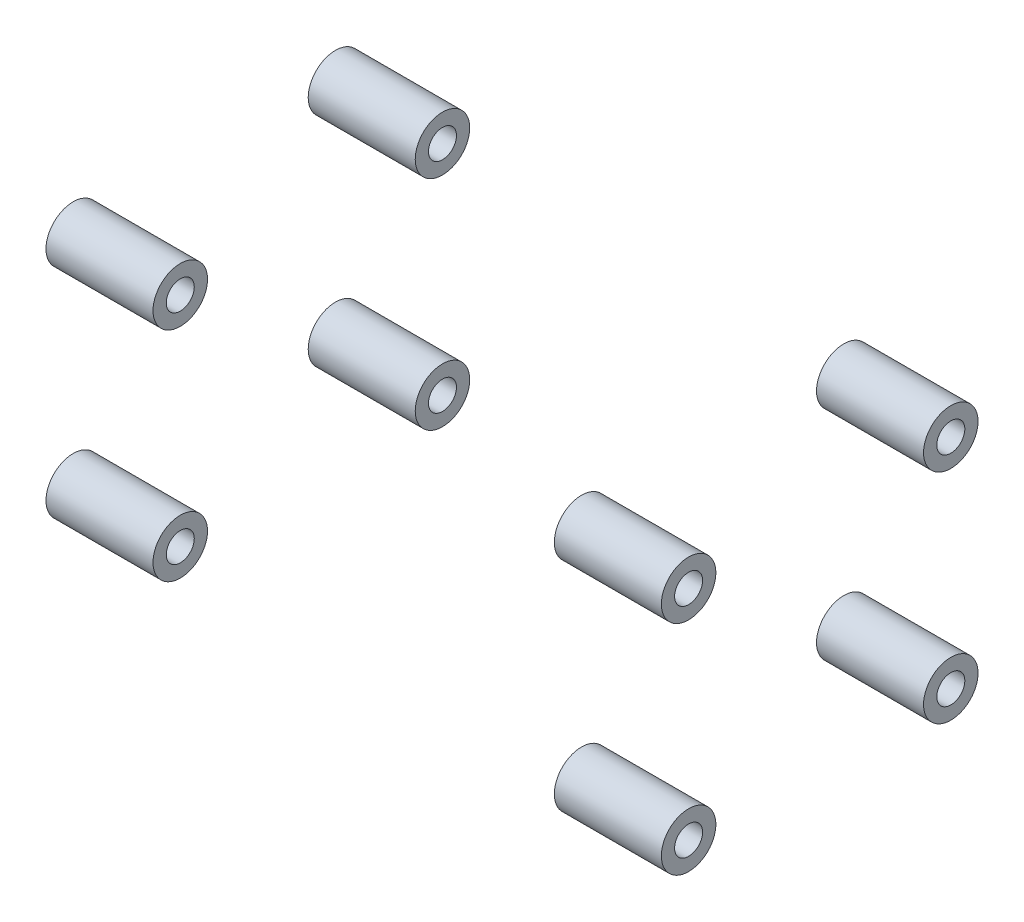
ISO-10303-21;
HEADER;
FILE_DESCRIPTION(('STEP AP214'),'2;1');
FILE_NAME('part.step','',(''),(''),'','','');
FILE_SCHEMA(('AUTOMOTIVE_DESIGN { 1 0 10303 214 1 1 1 1 }'));
ENDSEC;
DATA;
#1=APPLICATION_CONTEXT('core data for automotive mechanical design processes');
#2=APPLICATION_PROTOCOL_DEFINITION('international standard','automotive_design',2000,#1);
#3=PRODUCT_CONTEXT('',#1,'mechanical');
#4=PRODUCT('Part','Part','',(#3));
#5=PRODUCT_RELATED_PRODUCT_CATEGORY('part','',(#4));
#6=PRODUCT_DEFINITION_FORMATION('','',#4);
#7=PRODUCT_DEFINITION_CONTEXT('part definition',#1,'design');
#8=PRODUCT_DEFINITION('design','',#6,#7);
#9=PRODUCT_DEFINITION_SHAPE('','',#8);
#10=(LENGTH_UNIT() NAMED_UNIT(*) SI_UNIT(.MILLI.,.METRE.));
#11=(NAMED_UNIT(*) PLANE_ANGLE_UNIT() SI_UNIT($,.RADIAN.));
#12=(NAMED_UNIT(*) SI_UNIT($,.STERADIAN.) SOLID_ANGLE_UNIT());
#13=UNCERTAINTY_MEASURE_WITH_UNIT(LENGTH_MEASURE(1.E-05),#10,'distance_accuracy_value','');
#14=(GEOMETRIC_REPRESENTATION_CONTEXT(3) GLOBAL_UNCERTAINTY_ASSIGNED_CONTEXT((#13)) GLOBAL_UNIT_ASSIGNED_CONTEXT((#10,
#11,#12)) REPRESENTATION_CONTEXT('',''));
#15=CARTESIAN_POINT('',(0.,0.,0.));
#16=DIRECTION('',(0.,0.,1.));
#17=DIRECTION('',(1.,0.,0.));
#18=AXIS2_PLACEMENT_3D('',#15,#16,#17);
#19=CARTESIAN_POINT('',(-23.379999952,-12.7,9.7272271159524));
#20=DIRECTION('',(-1.,0.,0.));
#21=DIRECTION('',(0.,0.,-1.));
#22=AXIS2_PLACEMENT_3D('',#19,#20,#21);
#23=PLANE('',#22);
#24=CARTESIAN_POINT('',(-23.379999952,-12.7,9.7272271159524));
#25=DIRECTION('',(1.,0.,0.));
#26=DIRECTION('',(0.,0.,-1.));
#27=AXIS2_PLACEMENT_3D('',#24,#25,#26);
#28=CIRCLE('',#27,3.175);
#29=CARTESIAN_POINT('',(-23.379999952,-12.7,6.55222711595241));
#30=VERTEX_POINT('',#29);
#31=EDGE_CURVE('E49',#30,#30,#28,.T.);
#32=ORIENTED_EDGE('',*,*,#31,.T.);
#33=EDGE_LOOP('',(#32));
#34=FACE_BOUND('',#33,.T.);
#35=CARTESIAN_POINT('',(-23.379999952,-12.7,9.7272271159524));
#36=DIRECTION('',(1.,0.,0.));
#37=DIRECTION('',(0.,0.,-1.));
#38=AXIS2_PLACEMENT_3D('',#35,#36,#37);
#39=CIRCLE('',#38,1.63195);
#40=CARTESIAN_POINT('',(-23.379999952,-12.7,8.0952771159524));
#41=VERTEX_POINT('',#40);
#42=EDGE_CURVE('E11',#41,#41,#39,.T.);
#43=ORIENTED_EDGE('',*,*,#42,.F.);
#44=EDGE_LOOP('',(#43));
#45=FACE_BOUND('',#44,.T.);
#46=ADVANCED_FACE('F46',(#34,#45),#23,.F.);
#47=CARTESIAN_POINT('',(-44.8302560250691,-12.7,9.7272271159524));
#48=DIRECTION('',(1.,0.,0.));
#49=DIRECTION('',(0.,0.,1.));
#50=AXIS2_PLACEMENT_3D('',#47,#48,#49);
#51=CYLINDRICAL_SURFACE('',#50,3.175);
#52=CARTESIAN_POINT('',(-35.849999904,-12.7,9.7272271159524));
#53=DIRECTION('',(-1.,0.,0.));
#54=DIRECTION('',(0.,0.,1.));
#55=AXIS2_PLACEMENT_3D('',#52,#53,#54);
#56=CIRCLE('',#55,3.175);
#57=CARTESIAN_POINT('',(-35.849999904,-12.7,12.9022271159524));
#58=VERTEX_POINT('',#57);
#59=EDGE_CURVE('E53',#58,#58,#56,.T.);
#60=ORIENTED_EDGE('',*,*,#59,.F.);
#61=EDGE_LOOP('',(#60));
#62=FACE_BOUND('',#61,.T.);
#63=ORIENTED_EDGE('',*,*,#31,.F.);
#64=EDGE_LOOP('',(#63));
#65=FACE_BOUND('',#64,.T.);
#66=ADVANCED_FACE('F68',(#62,#65),#51,.T.);
#67=CARTESIAN_POINT('',(-44.8302560250691,-12.7,9.7272271159524));
#68=DIRECTION('',(1.,0.,0.));
#69=DIRECTION('',(0.,0.,1.));
#70=AXIS2_PLACEMENT_3D('',#67,#68,#69);
#71=CYLINDRICAL_SURFACE('',#70,1.63195);
#72=CARTESIAN_POINT('',(-35.849999904,-12.7,9.7272271159524));
#73=DIRECTION('',(-1.,0.,0.));
#74=DIRECTION('',(0.,0.,1.));
#75=AXIS2_PLACEMENT_3D('',#72,#73,#74);
#76=CIRCLE('',#75,1.63195);
#77=CARTESIAN_POINT('',(-35.849999904,-12.7,11.3591771159524));
#78=VERTEX_POINT('',#77);
#79=EDGE_CURVE('E59',#78,#78,#76,.T.);
#80=ORIENTED_EDGE('',*,*,#79,.T.);
#81=EDGE_LOOP('',(#80));
#82=FACE_BOUND('',#81,.T.);
#83=ORIENTED_EDGE('',*,*,#42,.T.);
#84=EDGE_LOOP('',(#83));
#85=FACE_BOUND('',#84,.T.);
#86=ADVANCED_FACE('F70',(#82,#85),#71,.F.);
#87=CARTESIAN_POINT('',(-35.849999904,0.,0.));
#88=DIRECTION('',(1.,0.,0.));
#89=DIRECTION('',(0.,0.,1.));
#90=AXIS2_PLACEMENT_3D('',#87,#88,#89);
#91=PLANE('',#90);
#92=ORIENTED_EDGE('',*,*,#79,.F.);
#93=EDGE_LOOP('',(#92));
#94=FACE_BOUND('',#93,.T.);
#95=ORIENTED_EDGE('',*,*,#59,.T.);
#96=EDGE_LOOP('',(#95));
#97=FACE_BOUND('',#96,.T.);
#98=ADVANCED_FACE('F76',(#94,#97),#91,.F.);
#99=CLOSED_SHELL('',(#46,#66,#86,#98));
#100=MANIFOLD_SOLID_BREP('B2',#99);
#101=CARTESIAN_POINT('',(-23.379999952,-12.7,40.2790228840476));
#102=DIRECTION('',(-1.,0.,0.));
#103=DIRECTION('',(0.,0.,-1.));
#104=AXIS2_PLACEMENT_3D('',#101,#102,#103);
#105=PLANE('',#104);
#106=CARTESIAN_POINT('',(-23.379999952,-12.7,40.2790228840476));
#107=DIRECTION('',(1.,0.,0.));
#108=DIRECTION('',(0.,0.,-1.));
#109=AXIS2_PLACEMENT_3D('',#106,#107,#108);
#110=CIRCLE('',#109,3.175);
#111=CARTESIAN_POINT('',(-23.379999952,-12.7,37.1040228840476));
#112=VERTEX_POINT('',#111);
#113=EDGE_CURVE('E127',#112,#112,#110,.T.);
#114=ORIENTED_EDGE('',*,*,#113,.T.);
#115=EDGE_LOOP('',(#114));
#116=FACE_BOUND('',#115,.T.);
#117=CARTESIAN_POINT('',(-23.379999952,-12.7,40.2790228840476));
#118=DIRECTION('',(1.,0.,0.));
#119=DIRECTION('',(0.,0.,-1.));
#120=AXIS2_PLACEMENT_3D('',#117,#118,#119);
#121=CIRCLE('',#120,1.63195);
#122=CARTESIAN_POINT('',(-23.379999952,-12.7,38.6470728840476));
#123=VERTEX_POINT('',#122);
#124=EDGE_CURVE('E45',#123,#123,#121,.T.);
#125=ORIENTED_EDGE('',*,*,#124,.F.);
#126=EDGE_LOOP('',(#125));
#127=FACE_BOUND('',#126,.T.);
#128=ADVANCED_FACE('F124',(#116,#127),#105,.F.);
#129=CARTESIAN_POINT('',(-44.8302560250691,-12.7,40.2790228840476));
#130=DIRECTION('',(1.,0.,0.));
#131=DIRECTION('',(0.,0.,1.));
#132=AXIS2_PLACEMENT_3D('',#129,#130,#131);
#133=CYLINDRICAL_SURFACE('',#132,3.175);
#134=CARTESIAN_POINT('',(-35.849999904,-12.7,40.2790228840476));
#135=DIRECTION('',(-1.,0.,0.));
#136=DIRECTION('',(0.,0.,1.));
#137=AXIS2_PLACEMENT_3D('',#134,#135,#136);
#138=CIRCLE('',#137,3.175);
#139=CARTESIAN_POINT('',(-35.849999904,-12.7,43.4540228840476));
#140=VERTEX_POINT('',#139);
#141=EDGE_CURVE('E131',#140,#140,#138,.T.);
#142=ORIENTED_EDGE('',*,*,#141,.F.);
#143=EDGE_LOOP('',(#142));
#144=FACE_BOUND('',#143,.T.);
#145=ORIENTED_EDGE('',*,*,#113,.F.);
#146=EDGE_LOOP('',(#145));
#147=FACE_BOUND('',#146,.T.);
#148=ADVANCED_FACE('F146',(#144,#147),#133,.T.);
#149=CARTESIAN_POINT('',(-44.8302560250691,-12.7,40.2790228840476));
#150=DIRECTION('',(1.,0.,0.));
#151=DIRECTION('',(0.,0.,1.));
#152=AXIS2_PLACEMENT_3D('',#149,#150,#151);
#153=CYLINDRICAL_SURFACE('',#152,1.63195);
#154=CARTESIAN_POINT('',(-35.849999904,-12.7,40.2790228840476));
#155=DIRECTION('',(-1.,0.,0.));
#156=DIRECTION('',(0.,0.,1.));
#157=AXIS2_PLACEMENT_3D('',#154,#155,#156);
#158=CIRCLE('',#157,1.63195);
#159=CARTESIAN_POINT('',(-35.849999904,-12.7,41.9109728840476));
#160=VERTEX_POINT('',#159);
#161=EDGE_CURVE('E137',#160,#160,#158,.T.);
#162=ORIENTED_EDGE('',*,*,#161,.T.);
#163=EDGE_LOOP('',(#162));
#164=FACE_BOUND('',#163,.T.);
#165=ORIENTED_EDGE('',*,*,#124,.T.);
#166=EDGE_LOOP('',(#165));
#167=FACE_BOUND('',#166,.T.);
#168=ADVANCED_FACE('F148',(#164,#167),#153,.F.);
#169=CARTESIAN_POINT('',(-35.849999904,0.,0.));
#170=DIRECTION('',(1.,0.,0.));
#171=DIRECTION('',(0.,0.,1.));
#172=AXIS2_PLACEMENT_3D('',#169,#170,#171);
#173=PLANE('',#172);
#174=ORIENTED_EDGE('',*,*,#161,.F.);
#175=EDGE_LOOP('',(#174));
#176=FACE_BOUND('',#175,.T.);
#177=ORIENTED_EDGE('',*,*,#141,.T.);
#178=EDGE_LOOP('',(#177));
#179=FACE_BOUND('',#178,.T.);
#180=ADVANCED_FACE('F154',(#176,#179),#173,.F.);
#181=CLOSED_SHELL('',(#128,#148,#168,#180));
#182=MANIFOLD_SOLID_BREP('B6',#181);
#183=CARTESIAN_POINT('',(-23.379999952,12.7,40.2790228840476));
#184=DIRECTION('',(-1.,0.,0.));
#185=DIRECTION('',(0.,0.,-1.));
#186=AXIS2_PLACEMENT_3D('',#183,#184,#185);
#187=PLANE('',#186);
#188=CARTESIAN_POINT('',(-23.379999952,12.7,40.2790228840476));
#189=DIRECTION('',(1.,0.,0.));
#190=DIRECTION('',(0.,0.,-1.));
#191=AXIS2_PLACEMENT_3D('',#188,#189,#190);
#192=CIRCLE('',#191,3.175);
#193=CARTESIAN_POINT('',(-23.379999952,12.7,37.1040228840476));
#194=VERTEX_POINT('',#193);
#195=EDGE_CURVE('E209',#194,#194,#192,.T.);
#196=ORIENTED_EDGE('',*,*,#195,.T.);
#197=EDGE_LOOP('',(#196));
#198=FACE_BOUND('',#197,.T.);
#199=CARTESIAN_POINT('',(-23.379999952,12.7,40.2790228840476));
#200=DIRECTION('',(1.,0.,0.));
#201=DIRECTION('',(0.,0.,-1.));
#202=AXIS2_PLACEMENT_3D('',#199,#200,#201);
#203=CIRCLE('',#202,1.63195);
#204=CARTESIAN_POINT('',(-23.379999952,12.7,38.6470728840476));
#205=VERTEX_POINT('',#204);
#206=EDGE_CURVE('E218',#205,#205,#203,.T.);
#207=ORIENTED_EDGE('',*,*,#206,.F.);
#208=EDGE_LOOP('',(#207));
#209=FACE_BOUND('',#208,.T.);
#210=ADVANCED_FACE('F202',(#198,#209),#187,.F.);
#211=CARTESIAN_POINT('',(-44.8302560250691,12.7,40.2790228840476));
#212=DIRECTION('',(1.,0.,0.));
#213=DIRECTION('',(0.,0.,1.));
#214=AXIS2_PLACEMENT_3D('',#211,#212,#213);
#215=CYLINDRICAL_SURFACE('',#214,3.175);
#216=CARTESIAN_POINT('',(-35.849999904,12.7,40.2790228840476));
#217=DIRECTION('',(-1.,0.,0.));
#218=DIRECTION('',(0.,0.,1.));
#219=AXIS2_PLACEMENT_3D('',#216,#217,#218);
#220=CIRCLE('',#219,3.175);
#221=CARTESIAN_POINT('',(-35.849999904,12.7,43.4540228840476));
#222=VERTEX_POINT('',#221);
#223=EDGE_CURVE('E213',#222,#222,#220,.T.);
#224=ORIENTED_EDGE('',*,*,#223,.F.);
#225=EDGE_LOOP('',(#224));
#226=FACE_BOUND('',#225,.T.);
#227=ORIENTED_EDGE('',*,*,#195,.F.);
#228=EDGE_LOOP('',(#227));
#229=FACE_BOUND('',#228,.T.);
#230=ADVANCED_FACE('F226',(#226,#229),#215,.T.);
#231=CARTESIAN_POINT('',(-44.8302560250691,12.7,40.2790228840476));
#232=DIRECTION('',(1.,0.,0.));
#233=DIRECTION('',(0.,0.,1.));
#234=AXIS2_PLACEMENT_3D('',#231,#232,#233);
#235=CYLINDRICAL_SURFACE('',#234,1.63195);
#236=CARTESIAN_POINT('',(-35.849999904,12.7,40.2790228840476));
#237=DIRECTION('',(-1.,0.,0.));
#238=DIRECTION('',(0.,0.,1.));
#239=AXIS2_PLACEMENT_3D('',#236,#237,#238);
#240=CIRCLE('',#239,1.63195);
#241=CARTESIAN_POINT('',(-35.849999904,12.7,41.9109728840476));
#242=VERTEX_POINT('',#241);
#243=EDGE_CURVE('E123',#242,#242,#240,.T.);
#244=ORIENTED_EDGE('',*,*,#243,.T.);
#245=EDGE_LOOP('',(#244));
#246=FACE_BOUND('',#245,.T.);
#247=ORIENTED_EDGE('',*,*,#206,.T.);
#248=EDGE_LOOP('',(#247));
#249=FACE_BOUND('',#248,.T.);
#250=ADVANCED_FACE('F223',(#246,#249),#235,.F.);
#251=CARTESIAN_POINT('',(-35.849999904,0.,0.));
#252=DIRECTION('',(1.,0.,0.));
#253=DIRECTION('',(0.,0.,1.));
#254=AXIS2_PLACEMENT_3D('',#251,#252,#253);
#255=PLANE('',#254);
#256=ORIENTED_EDGE('',*,*,#243,.F.);
#257=EDGE_LOOP('',(#256));
#258=FACE_BOUND('',#257,.T.);
#259=ORIENTED_EDGE('',*,*,#223,.T.);
#260=EDGE_LOOP('',(#259));
#261=FACE_BOUND('',#260,.T.);
#262=ADVANCED_FACE('F204',(#258,#261),#255,.F.);
#263=CLOSED_SHELL('',(#210,#230,#250,#262));
#264=MANIFOLD_SOLID_BREP('B40',#263);
#265=CARTESIAN_POINT('',(-23.379999952,12.7,9.7272271159524));
#266=DIRECTION('',(-1.,0.,0.));
#267=DIRECTION('',(0.,0.,-1.));
#268=AXIS2_PLACEMENT_3D('',#265,#266,#267);
#269=PLANE('',#268);
#270=CARTESIAN_POINT('',(-23.379999952,12.7,9.7272271159524));
#271=DIRECTION('',(1.,0.,0.));
#272=DIRECTION('',(0.,0.,-1.));
#273=AXIS2_PLACEMENT_3D('',#270,#271,#272);
#274=CIRCLE('',#273,3.175);
#275=CARTESIAN_POINT('',(-23.379999952,12.7,6.55222711595241));
#276=VERTEX_POINT('',#275);
#277=EDGE_CURVE('E283',#276,#276,#274,.T.);
#278=ORIENTED_EDGE('',*,*,#277,.T.);
#279=EDGE_LOOP('',(#278));
#280=FACE_BOUND('',#279,.T.);
#281=CARTESIAN_POINT('',(-23.379999952,12.7,9.7272271159524));
#282=DIRECTION('',(1.,0.,0.));
#283=DIRECTION('',(0.,0.,-1.));
#284=AXIS2_PLACEMENT_3D('',#281,#282,#283);
#285=CIRCLE('',#284,1.63195);
#286=CARTESIAN_POINT('',(-23.379999952,12.7,8.0952771159524));
#287=VERTEX_POINT('',#286);
#288=EDGE_CURVE('E201',#287,#287,#285,.T.);
#289=ORIENTED_EDGE('',*,*,#288,.F.);
#290=EDGE_LOOP('',(#289));
#291=FACE_BOUND('',#290,.T.);
#292=ADVANCED_FACE('F280',(#280,#291),#269,.F.);
#293=CARTESIAN_POINT('',(-44.8302560250691,12.7,9.7272271159524));
#294=DIRECTION('',(1.,0.,0.));
#295=DIRECTION('',(0.,0.,1.));
#296=AXIS2_PLACEMENT_3D('',#293,#294,#295);
#297=CYLINDRICAL_SURFACE('',#296,3.175);
#298=CARTESIAN_POINT('',(-35.849999904,12.7,9.7272271159524));
#299=DIRECTION('',(-1.,0.,0.));
#300=DIRECTION('',(0.,0.,1.));
#301=AXIS2_PLACEMENT_3D('',#298,#299,#300);
#302=CIRCLE('',#301,3.175);
#303=CARTESIAN_POINT('',(-35.849999904,12.7,12.9022271159524));
#304=VERTEX_POINT('',#303);
#305=EDGE_CURVE('E287',#304,#304,#302,.T.);
#306=ORIENTED_EDGE('',*,*,#305,.F.);
#307=EDGE_LOOP('',(#306));
#308=FACE_BOUND('',#307,.T.);
#309=ORIENTED_EDGE('',*,*,#277,.F.);
#310=EDGE_LOOP('',(#309));
#311=FACE_BOUND('',#310,.T.);
#312=ADVANCED_FACE('F302',(#308,#311),#297,.T.);
#313=CARTESIAN_POINT('',(-44.8302560250691,12.7,9.7272271159524));
#314=DIRECTION('',(1.,0.,0.));
#315=DIRECTION('',(0.,0.,1.));
#316=AXIS2_PLACEMENT_3D('',#313,#314,#315);
#317=CYLINDRICAL_SURFACE('',#316,1.63195);
#318=CARTESIAN_POINT('',(-35.849999904,12.7,9.7272271159524));
#319=DIRECTION('',(-1.,0.,0.));
#320=DIRECTION('',(0.,0.,1.));
#321=AXIS2_PLACEMENT_3D('',#318,#319,#320);
#322=CIRCLE('',#321,1.63195);
#323=CARTESIAN_POINT('',(-35.849999904,12.7,11.3591771159524));
#324=VERTEX_POINT('',#323);
#325=EDGE_CURVE('E293',#324,#324,#322,.T.);
#326=ORIENTED_EDGE('',*,*,#325,.T.);
#327=EDGE_LOOP('',(#326));
#328=FACE_BOUND('',#327,.T.);
#329=ORIENTED_EDGE('',*,*,#288,.T.);
#330=EDGE_LOOP('',(#329));
#331=FACE_BOUND('',#330,.T.);
#332=ADVANCED_FACE('F304',(#328,#331),#317,.F.);
#333=CARTESIAN_POINT('',(-35.849999904,0.,0.));
#334=DIRECTION('',(1.,0.,0.));
#335=DIRECTION('',(0.,0.,1.));
#336=AXIS2_PLACEMENT_3D('',#333,#334,#335);
#337=PLANE('',#336);
#338=ORIENTED_EDGE('',*,*,#325,.F.);
#339=EDGE_LOOP('',(#338));
#340=FACE_BOUND('',#339,.T.);
#341=ORIENTED_EDGE('',*,*,#305,.T.);
#342=EDGE_LOOP('',(#341));
#343=FACE_BOUND('',#342,.T.);
#344=ADVANCED_FACE('F310',(#340,#343),#337,.F.);
#345=CLOSED_SHELL('',(#292,#312,#332,#344));
#346=MANIFOLD_SOLID_BREP('B118',#345);
#347=CARTESIAN_POINT('',(23.379999952,12.7,9.7272271159524));
#348=DIRECTION('',(1.,0.,0.));
#349=DIRECTION('',(0.,0.,-1.));
#350=AXIS2_PLACEMENT_3D('',#347,#348,#349);
#351=PLANE('',#350);
#352=CARTESIAN_POINT('',(23.379999952,12.7,9.7272271159524));
#353=DIRECTION('',(1.,0.,0.));
#354=DIRECTION('',(0.,0.,-1.));
#355=AXIS2_PLACEMENT_3D('',#352,#353,#354);
#356=CIRCLE('',#355,3.175);
#357=CARTESIAN_POINT('',(23.379999952,12.7,6.55222711595241));
#358=VERTEX_POINT('',#357);
#359=EDGE_CURVE('E361',#358,#358,#356,.T.);
#360=ORIENTED_EDGE('',*,*,#359,.F.);
#361=EDGE_LOOP('',(#360));
#362=FACE_BOUND('',#361,.T.);
#363=CARTESIAN_POINT('',(23.379999952,12.7,9.7272271159524));
#364=DIRECTION('',(1.,0.,0.));
#365=DIRECTION('',(0.,0.,-1.));
#366=AXIS2_PLACEMENT_3D('',#363,#364,#365);
#367=CIRCLE('',#366,1.63195);
#368=CARTESIAN_POINT('',(23.379999952,12.7,8.0952771159524));
#369=VERTEX_POINT('',#368);
#370=EDGE_CURVE('E279',#369,#369,#367,.T.);
#371=ORIENTED_EDGE('',*,*,#370,.T.);
#372=EDGE_LOOP('',(#371));
#373=FACE_BOUND('',#372,.T.);
#374=ADVANCED_FACE('F358',(#362,#373),#351,.F.);
#375=CARTESIAN_POINT('',(44.8302560250691,12.7,9.7272271159524));
#376=DIRECTION('',(-1.,0.,0.));
#377=DIRECTION('',(0.,0.,1.));
#378=AXIS2_PLACEMENT_3D('',#375,#376,#377);
#379=CYLINDRICAL_SURFACE('',#378,3.175);
#380=CARTESIAN_POINT('',(35.849999904,12.7,9.7272271159524));
#381=DIRECTION('',(-1.,0.,0.));
#382=DIRECTION('',(0.,0.,1.));
#383=AXIS2_PLACEMENT_3D('',#380,#381,#382);
#384=CIRCLE('',#383,3.175);
#385=CARTESIAN_POINT('',(35.849999904,12.7,12.9022271159524));
#386=VERTEX_POINT('',#385);
#387=EDGE_CURVE('E365',#386,#386,#384,.T.);
#388=ORIENTED_EDGE('',*,*,#387,.T.);
#389=EDGE_LOOP('',(#388));
#390=FACE_BOUND('',#389,.T.);
#391=ORIENTED_EDGE('',*,*,#359,.T.);
#392=EDGE_LOOP('',(#391));
#393=FACE_BOUND('',#392,.T.);
#394=ADVANCED_FACE('F378',(#390,#393),#379,.T.);
#395=CARTESIAN_POINT('',(44.8302560250691,12.7,9.7272271159524));
#396=DIRECTION('',(-1.,0.,0.));
#397=DIRECTION('',(0.,0.,1.));
#398=AXIS2_PLACEMENT_3D('',#395,#396,#397);
#399=CYLINDRICAL_SURFACE('',#398,1.63195);
#400=CARTESIAN_POINT('',(35.849999904,12.7,9.7272271159524));
#401=DIRECTION('',(-1.,0.,0.));
#402=DIRECTION('',(0.,0.,1.));
#403=AXIS2_PLACEMENT_3D('',#400,#401,#402);
#404=CIRCLE('',#403,1.63195);
#405=CARTESIAN_POINT('',(35.849999904,12.7,11.3591771159524));
#406=VERTEX_POINT('',#405);
#407=EDGE_CURVE('E371',#406,#406,#404,.T.);
#408=ORIENTED_EDGE('',*,*,#407,.F.);
#409=EDGE_LOOP('',(#408));
#410=FACE_BOUND('',#409,.T.);
#411=ORIENTED_EDGE('',*,*,#370,.F.);
#412=EDGE_LOOP('',(#411));
#413=FACE_BOUND('',#412,.T.);
#414=ADVANCED_FACE('F384',(#410,#413),#399,.F.);
#415=CARTESIAN_POINT('',(35.849999904,0.,0.));
#416=DIRECTION('',(-1.,0.,0.));
#417=DIRECTION('',(0.,0.,1.));
#418=AXIS2_PLACEMENT_3D('',#415,#416,#417);
#419=PLANE('',#418);
#420=ORIENTED_EDGE('',*,*,#407,.T.);
#421=EDGE_LOOP('',(#420));
#422=FACE_BOUND('',#421,.T.);
#423=ORIENTED_EDGE('',*,*,#387,.F.);
#424=EDGE_LOOP('',(#423));
#425=FACE_BOUND('',#424,.T.);
#426=ADVANCED_FACE('F389',(#422,#425),#419,.F.);
#427=CLOSED_SHELL('',(#374,#394,#414,#426));
#428=MANIFOLD_SOLID_BREP('B196',#427);
#429=CARTESIAN_POINT('',(23.379999952,-12.7,9.7272271159524));
#430=DIRECTION('',(1.,0.,0.));
#431=DIRECTION('',(0.,0.,-1.));
#432=AXIS2_PLACEMENT_3D('',#429,#430,#431);
#433=PLANE('',#432);
#434=CARTESIAN_POINT('',(23.379999952,-12.7,9.7272271159524));
#435=DIRECTION('',(1.,0.,0.));
#436=DIRECTION('',(0.,0.,-1.));
#437=AXIS2_PLACEMENT_3D('',#434,#435,#436);
#438=CIRCLE('',#437,3.175);
#439=CARTESIAN_POINT('',(23.379999952,-12.7,6.55222711595241));
#440=VERTEX_POINT('',#439);
#441=EDGE_CURVE('E439',#440,#440,#438,.T.);
#442=ORIENTED_EDGE('',*,*,#441,.F.);
#443=EDGE_LOOP('',(#442));
#444=FACE_BOUND('',#443,.T.);
#445=CARTESIAN_POINT('',(23.379999952,-12.7,9.7272271159524));
#446=DIRECTION('',(1.,0.,0.));
#447=DIRECTION('',(0.,0.,-1.));
#448=AXIS2_PLACEMENT_3D('',#445,#446,#447);
#449=CIRCLE('',#448,1.63195);
#450=CARTESIAN_POINT('',(23.379999952,-12.7,8.0952771159524));
#451=VERTEX_POINT('',#450);
#452=EDGE_CURVE('E357',#451,#451,#449,.T.);
#453=ORIENTED_EDGE('',*,*,#452,.T.);
#454=EDGE_LOOP('',(#453));
#455=FACE_BOUND('',#454,.T.);
#456=ADVANCED_FACE('F436',(#444,#455),#433,.F.);
#457=CARTESIAN_POINT('',(44.8302560250691,-12.7,9.7272271159524));
#458=DIRECTION('',(-1.,0.,0.));
#459=DIRECTION('',(0.,0.,1.));
#460=AXIS2_PLACEMENT_3D('',#457,#458,#459);
#461=CYLINDRICAL_SURFACE('',#460,3.175);
#462=CARTESIAN_POINT('',(35.849999904,-12.7,9.7272271159524));
#463=DIRECTION('',(-1.,0.,0.));
#464=DIRECTION('',(0.,0.,1.));
#465=AXIS2_PLACEMENT_3D('',#462,#463,#464);
#466=CIRCLE('',#465,3.175);
#467=CARTESIAN_POINT('',(35.849999904,-12.7,12.9022271159524));
#468=VERTEX_POINT('',#467);
#469=EDGE_CURVE('E443',#468,#468,#466,.T.);
#470=ORIENTED_EDGE('',*,*,#469,.T.);
#471=EDGE_LOOP('',(#470));
#472=FACE_BOUND('',#471,.T.);
#473=ORIENTED_EDGE('',*,*,#441,.T.);
#474=EDGE_LOOP('',(#473));
#475=FACE_BOUND('',#474,.T.);
#476=ADVANCED_FACE('F456',(#472,#475),#461,.T.);
#477=CARTESIAN_POINT('',(44.8302560250691,-12.7,9.7272271159524));
#478=DIRECTION('',(-1.,0.,0.));
#479=DIRECTION('',(0.,0.,1.));
#480=AXIS2_PLACEMENT_3D('',#477,#478,#479);
#481=CYLINDRICAL_SURFACE('',#480,1.63195);
#482=CARTESIAN_POINT('',(35.849999904,-12.7,9.7272271159524));
#483=DIRECTION('',(-1.,0.,0.));
#484=DIRECTION('',(0.,0.,1.));
#485=AXIS2_PLACEMENT_3D('',#482,#483,#484);
#486=CIRCLE('',#485,1.63195);
#487=CARTESIAN_POINT('',(35.849999904,-12.7,11.3591771159524));
#488=VERTEX_POINT('',#487);
#489=EDGE_CURVE('E449',#488,#488,#486,.T.);
#490=ORIENTED_EDGE('',*,*,#489,.F.);
#491=EDGE_LOOP('',(#490));
#492=FACE_BOUND('',#491,.T.);
#493=ORIENTED_EDGE('',*,*,#452,.F.);
#494=EDGE_LOOP('',(#493));
#495=FACE_BOUND('',#494,.T.);
#496=ADVANCED_FACE('F462',(#492,#495),#481,.F.);
#497=CARTESIAN_POINT('',(35.849999904,0.,0.));
#498=DIRECTION('',(-1.,0.,0.));
#499=DIRECTION('',(0.,0.,1.));
#500=AXIS2_PLACEMENT_3D('',#497,#498,#499);
#501=PLANE('',#500);
#502=ORIENTED_EDGE('',*,*,#489,.T.);
#503=EDGE_LOOP('',(#502));
#504=FACE_BOUND('',#503,.T.);
#505=ORIENTED_EDGE('',*,*,#469,.F.);
#506=EDGE_LOOP('',(#505));
#507=FACE_BOUND('',#506,.T.);
#508=ADVANCED_FACE('F467',(#504,#507),#501,.F.);
#509=CLOSED_SHELL('',(#456,#476,#496,#508));
#510=MANIFOLD_SOLID_BREP('B274',#509);
#511=CARTESIAN_POINT('',(23.379999952,-12.7,40.2790228840476));
#512=DIRECTION('',(1.,0.,0.));
#513=DIRECTION('',(0.,0.,-1.));
#514=AXIS2_PLACEMENT_3D('',#511,#512,#513);
#515=PLANE('',#514);
#516=CARTESIAN_POINT('',(23.379999952,-12.7,40.2790228840476));
#517=DIRECTION('',(1.,0.,0.));
#518=DIRECTION('',(0.,0.,-1.));
#519=AXIS2_PLACEMENT_3D('',#516,#517,#518);
#520=CIRCLE('',#519,3.175);
#521=CARTESIAN_POINT('',(23.379999952,-12.7,37.1040228840476));
#522=VERTEX_POINT('',#521);
#523=EDGE_CURVE('E516',#522,#522,#520,.T.);
#524=ORIENTED_EDGE('',*,*,#523,.F.);
#525=EDGE_LOOP('',(#524));
#526=FACE_BOUND('',#525,.T.);
#527=CARTESIAN_POINT('',(23.379999952,-12.7,40.2790228840476));
#528=DIRECTION('',(1.,0.,0.));
#529=DIRECTION('',(0.,0.,-1.));
#530=AXIS2_PLACEMENT_3D('',#527,#528,#529);
#531=CIRCLE('',#530,1.63195);
#532=CARTESIAN_POINT('',(23.379999952,-12.7,38.6470728840476));
#533=VERTEX_POINT('',#532);
#534=EDGE_CURVE('E435',#533,#533,#531,.T.);
#535=ORIENTED_EDGE('',*,*,#534,.T.);
#536=EDGE_LOOP('',(#535));
#537=FACE_BOUND('',#536,.T.);
#538=ADVANCED_FACE('F513',(#526,#537),#515,.F.);
#539=CARTESIAN_POINT('',(44.8302560250691,-12.7,40.2790228840476));
#540=DIRECTION('',(-1.,0.,0.));
#541=DIRECTION('',(0.,0.,1.));
#542=AXIS2_PLACEMENT_3D('',#539,#540,#541);
#543=CYLINDRICAL_SURFACE('',#542,3.175);
#544=CARTESIAN_POINT('',(35.849999904,-12.7,40.2790228840476));
#545=DIRECTION('',(-1.,0.,0.));
#546=DIRECTION('',(0.,0.,1.));
#547=AXIS2_PLACEMENT_3D('',#544,#545,#546);
#548=CIRCLE('',#547,3.175);
#549=CARTESIAN_POINT('',(35.849999904,-12.7,43.4540228840476));
#550=VERTEX_POINT('',#549);
#551=EDGE_CURVE('E520',#550,#550,#548,.T.);
#552=ORIENTED_EDGE('',*,*,#551,.T.);
#553=EDGE_LOOP('',(#552));
#554=FACE_BOUND('',#553,.T.);
#555=ORIENTED_EDGE('',*,*,#523,.T.);
#556=EDGE_LOOP('',(#555));
#557=FACE_BOUND('',#556,.T.);
#558=ADVANCED_FACE('F533',(#554,#557),#543,.T.);
#559=CARTESIAN_POINT('',(44.8302560250691,-12.7,40.2790228840476));
#560=DIRECTION('',(-1.,0.,0.));
#561=DIRECTION('',(0.,0.,1.));
#562=AXIS2_PLACEMENT_3D('',#559,#560,#561);
#563=CYLINDRICAL_SURFACE('',#562,1.63195);
#564=CARTESIAN_POINT('',(35.849999904,-12.7,40.2790228840476));
#565=DIRECTION('',(-1.,0.,0.));
#566=DIRECTION('',(0.,0.,1.));
#567=AXIS2_PLACEMENT_3D('',#564,#565,#566);
#568=CIRCLE('',#567,1.63195);
#569=CARTESIAN_POINT('',(35.849999904,-12.7,41.9109728840476));
#570=VERTEX_POINT('',#569);
#571=EDGE_CURVE('E526',#570,#570,#568,.T.);
#572=ORIENTED_EDGE('',*,*,#571,.F.);
#573=EDGE_LOOP('',(#572));
#574=FACE_BOUND('',#573,.T.);
#575=ORIENTED_EDGE('',*,*,#534,.F.);
#576=EDGE_LOOP('',(#575));
#577=FACE_BOUND('',#576,.T.);
#578=ADVANCED_FACE('F539',(#574,#577),#563,.F.);
#579=CARTESIAN_POINT('',(35.849999904,0.,0.));
#580=DIRECTION('',(-1.,0.,0.));
#581=DIRECTION('',(0.,0.,1.));
#582=AXIS2_PLACEMENT_3D('',#579,#580,#581);
#583=PLANE('',#582);
#584=ORIENTED_EDGE('',*,*,#571,.T.);
#585=EDGE_LOOP('',(#584));
#586=FACE_BOUND('',#585,.T.);
#587=ORIENTED_EDGE('',*,*,#551,.F.);
#588=EDGE_LOOP('',(#587));
#589=FACE_BOUND('',#588,.T.);
#590=ADVANCED_FACE('F544',(#586,#589),#583,.F.);
#591=CLOSED_SHELL('',(#538,#558,#578,#590));
#592=MANIFOLD_SOLID_BREP('B352',#591);
#593=CARTESIAN_POINT('',(23.379999952,12.7,40.2790228840476));
#594=DIRECTION('',(1.,0.,0.));
#595=DIRECTION('',(0.,0.,-1.));
#596=AXIS2_PLACEMENT_3D('',#593,#594,#595);
#597=PLANE('',#596);
#598=CARTESIAN_POINT('',(23.379999952,12.7,40.2790228840476));
#599=DIRECTION('',(1.,0.,0.));
#600=DIRECTION('',(0.,0.,-1.));
#601=AXIS2_PLACEMENT_3D('',#598,#599,#600);
#602=CIRCLE('',#601,3.175);
#603=CARTESIAN_POINT('',(23.379999952,12.7,37.1040228840476));
#604=VERTEX_POINT('',#603);
#605=EDGE_CURVE('E590',#604,#604,#602,.T.);
#606=ORIENTED_EDGE('',*,*,#605,.F.);
#607=EDGE_LOOP('',(#606));
#608=FACE_BOUND('',#607,.T.);
#609=CARTESIAN_POINT('',(23.379999952,12.7,40.2790228840476));
#610=DIRECTION('',(1.,0.,0.));
#611=DIRECTION('',(0.,0.,-1.));
#612=AXIS2_PLACEMENT_3D('',#609,#610,#611);
#613=CIRCLE('',#612,1.63195);
#614=CARTESIAN_POINT('',(23.379999952,12.7,38.6470728840476));
#615=VERTEX_POINT('',#614);
#616=EDGE_CURVE('E599',#615,#615,#613,.T.);
#617=ORIENTED_EDGE('',*,*,#616,.T.);
#618=EDGE_LOOP('',(#617));
#619=FACE_BOUND('',#618,.T.);
#620=ADVANCED_FACE('F583',(#608,#619),#597,.F.);
#621=CARTESIAN_POINT('',(44.8302560250691,12.7,40.2790228840476));
#622=DIRECTION('',(-1.,0.,0.));
#623=DIRECTION('',(0.,0.,1.));
#624=AXIS2_PLACEMENT_3D('',#621,#622,#623);
#625=CYLINDRICAL_SURFACE('',#624,3.175);
#626=CARTESIAN_POINT('',(35.849999904,12.7,40.2790228840476));
#627=DIRECTION('',(-1.,0.,0.));
#628=DIRECTION('',(0.,0.,1.));
#629=AXIS2_PLACEMENT_3D('',#626,#627,#628);
#630=CIRCLE('',#629,3.175);
#631=CARTESIAN_POINT('',(35.849999904,12.7,43.4540228840476));
#632=VERTEX_POINT('',#631);
#633=EDGE_CURVE('E594',#632,#632,#630,.T.);
#634=ORIENTED_EDGE('',*,*,#633,.T.);
#635=EDGE_LOOP('',(#634));
#636=FACE_BOUND('',#635,.T.);
#637=ORIENTED_EDGE('',*,*,#605,.T.);
#638=EDGE_LOOP('',(#637));
#639=FACE_BOUND('',#638,.T.);
#640=ADVANCED_FACE('F607',(#636,#639),#625,.T.);
#641=CARTESIAN_POINT('',(44.8302560250691,12.7,40.2790228840476));
#642=DIRECTION('',(-1.,0.,0.));
#643=DIRECTION('',(0.,0.,1.));
#644=AXIS2_PLACEMENT_3D('',#641,#642,#643);
#645=CYLINDRICAL_SURFACE('',#644,1.63195);
#646=CARTESIAN_POINT('',(35.849999904,12.7,40.2790228840476));
#647=DIRECTION('',(-1.,0.,0.));
#648=DIRECTION('',(0.,0.,1.));
#649=AXIS2_PLACEMENT_3D('',#646,#647,#648);
#650=CIRCLE('',#649,1.63195);
#651=CARTESIAN_POINT('',(35.849999904,12.7,41.9109728840476));
#652=VERTEX_POINT('',#651);
#653=EDGE_CURVE('E512',#652,#652,#650,.T.);
#654=ORIENTED_EDGE('',*,*,#653,.F.);
#655=EDGE_LOOP('',(#654));
#656=FACE_BOUND('',#655,.T.);
#657=ORIENTED_EDGE('',*,*,#616,.F.);
#658=EDGE_LOOP('',(#657));
#659=FACE_BOUND('',#658,.T.);
#660=ADVANCED_FACE('F605',(#656,#659),#645,.F.);
#661=CARTESIAN_POINT('',(35.849999904,0.,0.));
#662=DIRECTION('',(-1.,0.,0.));
#663=DIRECTION('',(0.,0.,1.));
#664=AXIS2_PLACEMENT_3D('',#661,#662,#663);
#665=PLANE('',#664);
#666=ORIENTED_EDGE('',*,*,#653,.T.);
#667=EDGE_LOOP('',(#666));
#668=FACE_BOUND('',#667,.T.);
#669=ORIENTED_EDGE('',*,*,#633,.F.);
#670=EDGE_LOOP('',(#669));
#671=FACE_BOUND('',#670,.T.);
#672=ADVANCED_FACE('F585',(#668,#671),#665,.F.);
#673=CLOSED_SHELL('',(#620,#640,#660,#672));
#674=MANIFOLD_SOLID_BREP('B430',#673);
#675=ADVANCED_BREP_SHAPE_REPRESENTATION('',(#18,#100,#182,#264,#346,#428,#510,#592,#674),#14);
#676=SHAPE_DEFINITION_REPRESENTATION(#9,#675);
ENDSEC;
END-ISO-10303-21;
